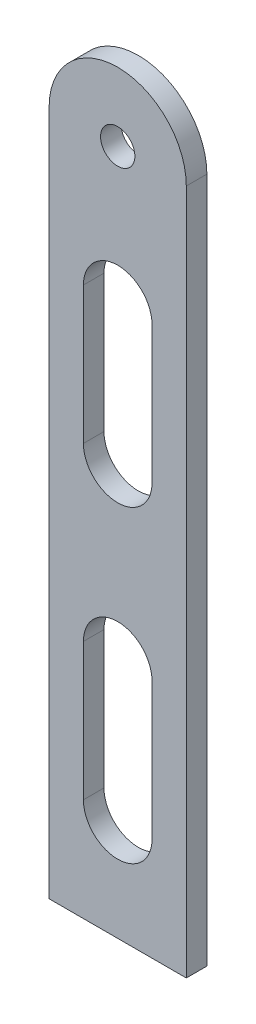
ISO-10303-21;
HEADER;
FILE_DESCRIPTION(('STEP AP214'),'2;1');
FILE_NAME('part.step','',(''),(''),'','','');
FILE_SCHEMA(('AUTOMOTIVE_DESIGN { 1 0 10303 214 1 1 1 1 }'));
ENDSEC;
DATA;
#1=APPLICATION_CONTEXT('core data for automotive mechanical design processes');
#2=APPLICATION_PROTOCOL_DEFINITION('international standard','automotive_design',2000,#1);
#3=PRODUCT_CONTEXT('',#1,'mechanical');
#4=PRODUCT('Part','Part','',(#3));
#5=PRODUCT_RELATED_PRODUCT_CATEGORY('part','',(#4));
#6=PRODUCT_DEFINITION_FORMATION('','',#4);
#7=PRODUCT_DEFINITION_CONTEXT('part definition',#1,'design');
#8=PRODUCT_DEFINITION('design','',#6,#7);
#9=PRODUCT_DEFINITION_SHAPE('','',#8);
#10=(LENGTH_UNIT() NAMED_UNIT(*) SI_UNIT(.MILLI.,.METRE.));
#11=(NAMED_UNIT(*) PLANE_ANGLE_UNIT() SI_UNIT($,.RADIAN.));
#12=(NAMED_UNIT(*) SI_UNIT($,.STERADIAN.) SOLID_ANGLE_UNIT());
#13=UNCERTAINTY_MEASURE_WITH_UNIT(LENGTH_MEASURE(1.E-05),#10,'distance_accuracy_value','');
#14=(GEOMETRIC_REPRESENTATION_CONTEXT(3) GLOBAL_UNCERTAINTY_ASSIGNED_CONTEXT((#13)) GLOBAL_UNIT_ASSIGNED_CONTEXT((#10,
#11,#12)) REPRESENTATION_CONTEXT('',''));
#15=CARTESIAN_POINT('',(0.,0.,0.));
#16=DIRECTION('',(0.,0.,1.));
#17=DIRECTION('',(1.,0.,0.));
#18=AXIS2_PLACEMENT_3D('',#15,#16,#17);
#19=CARTESIAN_POINT('',(0.,0.,3.));
#20=DIRECTION('',(0.,0.,1.));
#21=DIRECTION('',(1.,0.,0.));
#22=AXIS2_PLACEMENT_3D('',#19,#20,#21);
#23=PLANE('',#22);
#24=DIRECTION('',(0.,-1.,0.));
#25=VECTOR('',#24,1.);
#26=CARTESIAN_POINT('',(-5.,-20.0000000000001,3.));
#27=LINE('',#26,#25);
#28=CARTESIAN_POINT('',(-5.,-20.0000000000001,3.));
#29=VERTEX_POINT('',#28);
#30=CARTESIAN_POINT('',(-5.,-40.,3.));
#31=VERTEX_POINT('',#30);
#32=EDGE_CURVE('E159',#29,#31,#27,.T.);
#33=ORIENTED_EDGE('',*,*,#32,.F.);
#34=CARTESIAN_POINT('',(0.,-20.0000000000001,3.));
#35=DIRECTION('',(0.,0.,1.));
#36=DIRECTION('',(1.,0.,0.));
#37=AXIS2_PLACEMENT_3D('',#34,#35,#36);
#38=CIRCLE('',#37,5.);
#39=CARTESIAN_POINT('',(5.,-20.0000000000001,3.));
#40=VERTEX_POINT('',#39);
#41=EDGE_CURVE('E157',#40,#29,#38,.T.);
#42=ORIENTED_EDGE('',*,*,#41,.F.);
#43=DIRECTION('',(0.,1.,0.));
#44=VECTOR('',#43,1.);
#45=CARTESIAN_POINT('',(5.,-20.0000000000001,3.));
#46=LINE('',#45,#44);
#47=CARTESIAN_POINT('',(5.00000000000001,-40.,3.));
#48=VERTEX_POINT('',#47);
#49=EDGE_CURVE('E165',#48,#40,#46,.T.);
#50=ORIENTED_EDGE('',*,*,#49,.F.);
#51=CARTESIAN_POINT('',(0.,-40.,3.));
#52=DIRECTION('',(0.,0.,1.));
#53=DIRECTION('',(1.,0.,0.));
#54=AXIS2_PLACEMENT_3D('',#51,#52,#53);
#55=CIRCLE('',#54,5.);
#56=EDGE_CURVE('E162',#31,#48,#55,.T.);
#57=ORIENTED_EDGE('',*,*,#56,.F.);
#58=EDGE_LOOP('',(#33,#42,#50,#57));
#59=FACE_BOUND('',#58,.T.);
#60=CARTESIAN_POINT('',(0.,0.,3.));
#61=DIRECTION('',(0.,0.,1.));
#62=DIRECTION('',(1.,0.,0.));
#63=AXIS2_PLACEMENT_3D('',#60,#61,#62);
#64=CIRCLE('',#63,10.);
#65=CARTESIAN_POINT('',(10.,0.,3.));
#66=VERTEX_POINT('',#65);
#67=CARTESIAN_POINT('',(-10.,0.,3.));
#68=VERTEX_POINT('',#67);
#69=EDGE_CURVE('E194',#66,#68,#64,.T.);
#70=ORIENTED_EDGE('',*,*,#69,.T.);
#71=DIRECTION('',(0.,-1.,0.));
#72=VECTOR('',#71,1.);
#73=CARTESIAN_POINT('',(-10.,0.,3.));
#74=LINE('',#73,#72);
#75=CARTESIAN_POINT('',(-9.99999999999999,-100.,3.));
#76=VERTEX_POINT('',#75);
#77=EDGE_CURVE('E197',#68,#76,#74,.T.);
#78=ORIENTED_EDGE('',*,*,#77,.T.);
#79=DIRECTION('',(1.,0.,0.));
#80=VECTOR('',#79,1.);
#81=CARTESIAN_POINT('',(-9.99999999999999,-100.,3.));
#82=LINE('',#81,#80);
#83=CARTESIAN_POINT('',(10.,-100.,3.));
#84=VERTEX_POINT('',#83);
#85=EDGE_CURVE('E200',#76,#84,#82,.T.);
#86=ORIENTED_EDGE('',*,*,#85,.T.);
#87=DIRECTION('',(0.,1.,0.));
#88=VECTOR('',#87,1.);
#89=CARTESIAN_POINT('',(10.,0.,3.));
#90=LINE('',#89,#88);
#91=EDGE_CURVE('E202',#84,#66,#90,.T.);
#92=ORIENTED_EDGE('',*,*,#91,.T.);
#93=EDGE_LOOP('',(#70,#78,#86,#92));
#94=FACE_BOUND('',#93,.T.);
#95=CARTESIAN_POINT('',(0.,0.,3.));
#96=DIRECTION('',(0.,0.,1.));
#97=DIRECTION('',(1.,0.,0.));
#98=AXIS2_PLACEMENT_3D('',#95,#96,#97);
#99=CIRCLE('',#98,2.5);
#100=CARTESIAN_POINT('',(2.5,0.,3.));
#101=VERTEX_POINT('',#100);
#102=EDGE_CURVE('E188',#101,#101,#99,.T.);
#103=ORIENTED_EDGE('',*,*,#102,.F.);
#104=EDGE_LOOP('',(#103));
#105=FACE_BOUND('',#104,.T.);
#106=DIRECTION('',(0.,1.,0.));
#107=VECTOR('',#106,1.);
#108=CARTESIAN_POINT('',(5.00000000000002,-85.,3.));
#109=LINE('',#108,#107);
#110=CARTESIAN_POINT('',(5.00000000000002,-85.,3.));
#111=VERTEX_POINT('',#110);
#112=CARTESIAN_POINT('',(5.00000000000002,-65.,3.));
#113=VERTEX_POINT('',#112);
#114=EDGE_CURVE('E129',#111,#113,#109,.T.);
#115=ORIENTED_EDGE('',*,*,#114,.F.);
#116=CARTESIAN_POINT('',(0.,-85.,3.));
#117=DIRECTION('',(0.,0.,1.));
#118=DIRECTION('',(1.,0.,0.));
#119=AXIS2_PLACEMENT_3D('',#116,#117,#118);
#120=CIRCLE('',#119,5.);
#121=CARTESIAN_POINT('',(-4.99999999999999,-85.,3.));
#122=VERTEX_POINT('',#121);
#123=EDGE_CURVE('E121',#122,#111,#120,.T.);
#124=ORIENTED_EDGE('',*,*,#123,.F.);
#125=DIRECTION('',(0.,-1.,0.));
#126=VECTOR('',#125,1.);
#127=CARTESIAN_POINT('',(-4.99999999999999,-85.,3.));
#128=LINE('',#127,#126);
#129=CARTESIAN_POINT('',(-4.99999999999999,-65.,3.));
#130=VERTEX_POINT('',#129);
#131=EDGE_CURVE('E143',#130,#122,#128,.T.);
#132=ORIENTED_EDGE('',*,*,#131,.F.);
#133=CARTESIAN_POINT('',(0.,-65.,3.));
#134=DIRECTION('',(0.,0.,1.));
#135=DIRECTION('',(1.,0.,0.));
#136=AXIS2_PLACEMENT_3D('',#133,#134,#135);
#137=CIRCLE('',#136,5.);
#138=EDGE_CURVE('E141',#113,#130,#137,.T.);
#139=ORIENTED_EDGE('',*,*,#138,.F.);
#140=EDGE_LOOP('',(#115,#124,#132,#139));
#141=FACE_BOUND('',#140,.T.);
#142=ADVANCED_FACE('F32',(#59,#94,#105,#141),#23,.T.);
#143=CARTESIAN_POINT('',(0.,0.,0.));
#144=DIRECTION('',(0.,0.,1.));
#145=DIRECTION('',(1.,0.,0.));
#146=AXIS2_PLACEMENT_3D('',#143,#144,#145);
#147=PLANE('',#146);
#148=CARTESIAN_POINT('',(0.,-20.0000000000001,0.));
#149=DIRECTION('',(0.,0.,1.));
#150=DIRECTION('',(1.,0.,0.));
#151=AXIS2_PLACEMENT_3D('',#148,#149,#150);
#152=CIRCLE('',#151,5.);
#153=CARTESIAN_POINT('',(5.,-20.0000000000001,0.));
#154=VERTEX_POINT('',#153);
#155=CARTESIAN_POINT('',(-5.,-20.0000000000001,0.));
#156=VERTEX_POINT('',#155);
#157=EDGE_CURVE('E137',#154,#156,#152,.T.);
#158=ORIENTED_EDGE('',*,*,#157,.T.);
#159=DIRECTION('',(0.,-1.,0.));
#160=VECTOR('',#159,1.);
#161=CARTESIAN_POINT('',(-5.,-20.0000000000001,0.));
#162=LINE('',#161,#160);
#163=CARTESIAN_POINT('',(-5.,-40.,0.));
#164=VERTEX_POINT('',#163);
#165=EDGE_CURVE('E170',#156,#164,#162,.T.);
#166=ORIENTED_EDGE('',*,*,#165,.T.);
#167=CARTESIAN_POINT('',(0.,-40.,0.));
#168=DIRECTION('',(0.,0.,1.));
#169=DIRECTION('',(1.,0.,0.));
#170=AXIS2_PLACEMENT_3D('',#167,#168,#169);
#171=CIRCLE('',#170,5.);
#172=CARTESIAN_POINT('',(5.00000000000001,-40.,0.));
#173=VERTEX_POINT('',#172);
#174=EDGE_CURVE('E173',#164,#173,#171,.T.);
#175=ORIENTED_EDGE('',*,*,#174,.T.);
#176=DIRECTION('',(0.,1.,0.));
#177=VECTOR('',#176,1.);
#178=CARTESIAN_POINT('',(5.,-20.0000000000001,0.));
#179=LINE('',#178,#177);
#180=EDGE_CURVE('E160',#173,#154,#179,.T.);
#181=ORIENTED_EDGE('',*,*,#180,.T.);
#182=EDGE_LOOP('',(#158,#166,#175,#181));
#183=FACE_BOUND('',#182,.T.);
#184=CARTESIAN_POINT('',(0.,0.,0.));
#185=DIRECTION('',(0.,0.,1.));
#186=DIRECTION('',(1.,0.,0.));
#187=AXIS2_PLACEMENT_3D('',#184,#185,#186);
#188=CIRCLE('',#187,10.);
#189=CARTESIAN_POINT('',(10.,0.,0.));
#190=VERTEX_POINT('',#189);
#191=CARTESIAN_POINT('',(-10.,0.,0.));
#192=VERTEX_POINT('',#191);
#193=EDGE_CURVE('E191',#190,#192,#188,.T.);
#194=ORIENTED_EDGE('',*,*,#193,.F.);
#195=DIRECTION('',(0.,1.,0.));
#196=VECTOR('',#195,1.);
#197=CARTESIAN_POINT('',(10.,0.,0.));
#198=LINE('',#197,#196);
#199=CARTESIAN_POINT('',(10.,-100.,0.));
#200=VERTEX_POINT('',#199);
#201=EDGE_CURVE('E198',#200,#190,#198,.T.);
#202=ORIENTED_EDGE('',*,*,#201,.F.);
#203=DIRECTION('',(1.,0.,0.));
#204=VECTOR('',#203,1.);
#205=CARTESIAN_POINT('',(-9.99999999999999,-100.,0.));
#206=LINE('',#205,#204);
#207=CARTESIAN_POINT('',(-9.99999999999999,-100.,0.));
#208=VERTEX_POINT('',#207);
#209=EDGE_CURVE('E209',#208,#200,#206,.T.);
#210=ORIENTED_EDGE('',*,*,#209,.F.);
#211=DIRECTION('',(0.,-1.,0.));
#212=VECTOR('',#211,1.);
#213=CARTESIAN_POINT('',(-10.,0.,0.));
#214=LINE('',#213,#212);
#215=EDGE_CURVE('E207',#192,#208,#214,.T.);
#216=ORIENTED_EDGE('',*,*,#215,.F.);
#217=EDGE_LOOP('',(#194,#202,#210,#216));
#218=FACE_BOUND('',#217,.T.);
#219=CARTESIAN_POINT('',(0.,0.,0.));
#220=DIRECTION('',(0.,0.,1.));
#221=DIRECTION('',(1.,0.,0.));
#222=AXIS2_PLACEMENT_3D('',#219,#220,#221);
#223=CIRCLE('',#222,2.5);
#224=CARTESIAN_POINT('',(2.5,0.,0.));
#225=VERTEX_POINT('',#224);
#226=EDGE_CURVE('E187',#225,#225,#223,.T.);
#227=ORIENTED_EDGE('',*,*,#226,.T.);
#228=EDGE_LOOP('',(#227));
#229=FACE_BOUND('',#228,.T.);
#230=CARTESIAN_POINT('',(0.,-85.,0.));
#231=DIRECTION('',(0.,0.,1.));
#232=DIRECTION('',(1.,0.,0.));
#233=AXIS2_PLACEMENT_3D('',#230,#231,#232);
#234=CIRCLE('',#233,5.);
#235=CARTESIAN_POINT('',(-4.99999999999999,-85.,0.));
#236=VERTEX_POINT('',#235);
#237=CARTESIAN_POINT('',(5.00000000000002,-85.,0.));
#238=VERTEX_POINT('',#237);
#239=EDGE_CURVE('E55',#236,#238,#234,.T.);
#240=ORIENTED_EDGE('',*,*,#239,.T.);
#241=DIRECTION('',(0.,1.,0.));
#242=VECTOR('',#241,1.);
#243=CARTESIAN_POINT('',(5.00000000000002,-85.,0.));
#244=LINE('',#243,#242);
#245=CARTESIAN_POINT('',(5.00000000000002,-65.,0.));
#246=VERTEX_POINT('',#245);
#247=EDGE_CURVE('E136',#238,#246,#244,.T.);
#248=ORIENTED_EDGE('',*,*,#247,.T.);
#249=CARTESIAN_POINT('',(0.,-65.,0.));
#250=DIRECTION('',(0.,0.,1.));
#251=DIRECTION('',(1.,0.,0.));
#252=AXIS2_PLACEMENT_3D('',#249,#250,#251);
#253=CIRCLE('',#252,5.);
#254=CARTESIAN_POINT('',(-4.99999999999999,-65.,0.));
#255=VERTEX_POINT('',#254);
#256=EDGE_CURVE('E149',#246,#255,#253,.T.);
#257=ORIENTED_EDGE('',*,*,#256,.T.);
#258=DIRECTION('',(0.,-1.,0.));
#259=VECTOR('',#258,1.);
#260=CARTESIAN_POINT('',(-4.99999999999999,-85.,0.));
#261=LINE('',#260,#259);
#262=EDGE_CURVE('E130',#255,#236,#261,.T.);
#263=ORIENTED_EDGE('',*,*,#262,.T.);
#264=EDGE_LOOP('',(#240,#248,#257,#263));
#265=FACE_BOUND('',#264,.T.);
#266=ADVANCED_FACE('F227',(#183,#218,#229,#265),#147,.F.);
#267=CARTESIAN_POINT('',(0.,0.,3.));
#268=DIRECTION('',(0.,0.,-1.));
#269=DIRECTION('',(-1.,0.,0.));
#270=AXIS2_PLACEMENT_3D('',#267,#268,#269);
#271=CYLINDRICAL_SURFACE('',#270,10.);
#272=ORIENTED_EDGE('',*,*,#193,.T.);
#273=DIRECTION('',(0.,0.,-1.));
#274=VECTOR('',#273,1.);
#275=CARTESIAN_POINT('',(-10.,0.,3.));
#276=LINE('',#275,#274);
#277=EDGE_CURVE('E11',#68,#192,#276,.T.);
#278=ORIENTED_EDGE('',*,*,#277,.F.);
#279=ORIENTED_EDGE('',*,*,#69,.F.);
#280=DIRECTION('',(0.,0.,-1.));
#281=VECTOR('',#280,1.);
#282=CARTESIAN_POINT('',(10.,0.,3.));
#283=LINE('',#282,#281);
#284=EDGE_CURVE('E204',#66,#190,#283,.T.);
#285=ORIENTED_EDGE('',*,*,#284,.T.);
#286=EDGE_LOOP('',(#272,#278,#279,#285));
#287=FACE_BOUND('',#286,.T.);
#288=ADVANCED_FACE('F34',(#287),#271,.T.);
#289=CARTESIAN_POINT('',(-10.,0.,3.));
#290=DIRECTION('',(1.,0.,0.));
#291=DIRECTION('',(0.,1.,0.));
#292=AXIS2_PLACEMENT_3D('',#289,#290,#291);
#293=PLANE('',#292);
#294=ORIENTED_EDGE('',*,*,#215,.T.);
#295=DIRECTION('',(0.,0.,-1.));
#296=VECTOR('',#295,1.);
#297=CARTESIAN_POINT('',(-9.99999999999999,-100.,3.));
#298=LINE('',#297,#296);
#299=EDGE_CURVE('E40',#76,#208,#298,.T.);
#300=ORIENTED_EDGE('',*,*,#299,.F.);
#301=ORIENTED_EDGE('',*,*,#77,.F.);
#302=ORIENTED_EDGE('',*,*,#277,.T.);
#303=EDGE_LOOP('',(#294,#300,#301,#302));
#304=FACE_BOUND('',#303,.T.);
#305=ADVANCED_FACE('F238',(#304),#293,.F.);
#306=CARTESIAN_POINT('',(-9.99999999999999,-100.,3.));
#307=DIRECTION('',(0.,1.,0.));
#308=DIRECTION('',(0.,0.,1.));
#309=AXIS2_PLACEMENT_3D('',#306,#307,#308);
#310=PLANE('',#309);
#311=ORIENTED_EDGE('',*,*,#209,.T.);
#312=DIRECTION('',(0.,0.,-1.));
#313=VECTOR('',#312,1.);
#314=CARTESIAN_POINT('',(10.,-100.,3.));
#315=LINE('',#314,#313);
#316=EDGE_CURVE('E214',#84,#200,#315,.T.);
#317=ORIENTED_EDGE('',*,*,#316,.F.);
#318=ORIENTED_EDGE('',*,*,#85,.F.);
#319=ORIENTED_EDGE('',*,*,#299,.T.);
#320=EDGE_LOOP('',(#311,#317,#318,#319));
#321=FACE_BOUND('',#320,.T.);
#322=ADVANCED_FACE('F221',(#321),#310,.F.);
#323=CARTESIAN_POINT('',(10.,0.,3.));
#324=DIRECTION('',(-1.,0.,0.));
#325=DIRECTION('',(0.,-1.,0.));
#326=AXIS2_PLACEMENT_3D('',#323,#324,#325);
#327=PLANE('',#326);
#328=ORIENTED_EDGE('',*,*,#201,.T.);
#329=ORIENTED_EDGE('',*,*,#284,.F.);
#330=ORIENTED_EDGE('',*,*,#91,.F.);
#331=ORIENTED_EDGE('',*,*,#316,.T.);
#332=EDGE_LOOP('',(#328,#329,#330,#331));
#333=FACE_BOUND('',#332,.T.);
#334=ADVANCED_FACE('F231',(#333),#327,.F.);
#335=CARTESIAN_POINT('',(0.,0.,3.));
#336=DIRECTION('',(0.,0.,-1.));
#337=DIRECTION('',(-1.,0.,0.));
#338=AXIS2_PLACEMENT_3D('',#335,#336,#337);
#339=CYLINDRICAL_SURFACE('',#338,2.5);
#340=ORIENTED_EDGE('',*,*,#102,.T.);
#341=EDGE_LOOP('',(#340));
#342=FACE_BOUND('',#341,.T.);
#343=ORIENTED_EDGE('',*,*,#226,.F.);
#344=EDGE_LOOP('',(#343));
#345=FACE_BOUND('',#344,.T.);
#346=ADVANCED_FACE('F255',(#342,#345),#339,.F.);
#347=CARTESIAN_POINT('',(0.,-20.0000000000001,3.));
#348=DIRECTION('',(0.,0.,-1.));
#349=DIRECTION('',(-1.,0.,0.));
#350=AXIS2_PLACEMENT_3D('',#347,#348,#349);
#351=CYLINDRICAL_SURFACE('',#350,5.);
#352=ORIENTED_EDGE('',*,*,#157,.F.);
#353=DIRECTION('',(0.,0.,-1.));
#354=VECTOR('',#353,1.);
#355=CARTESIAN_POINT('',(5.,-20.0000000000001,3.));
#356=LINE('',#355,#354);
#357=EDGE_CURVE('E167',#40,#154,#356,.T.);
#358=ORIENTED_EDGE('',*,*,#357,.F.);
#359=ORIENTED_EDGE('',*,*,#41,.T.);
#360=DIRECTION('',(0.,0.,-1.));
#361=VECTOR('',#360,1.);
#362=CARTESIAN_POINT('',(-5.,-20.0000000000001,3.));
#363=LINE('',#362,#361);
#364=EDGE_CURVE('E184',#29,#156,#363,.T.);
#365=ORIENTED_EDGE('',*,*,#364,.T.);
#366=EDGE_LOOP('',(#352,#358,#359,#365));
#367=FACE_BOUND('',#366,.T.);
#368=ADVANCED_FACE('F262',(#367),#351,.F.);
#369=CARTESIAN_POINT('',(-5.,-20.0000000000001,3.));
#370=DIRECTION('',(1.,0.,0.));
#371=DIRECTION('',(0.,1.,0.));
#372=AXIS2_PLACEMENT_3D('',#369,#370,#371);
#373=PLANE('',#372);
#374=ORIENTED_EDGE('',*,*,#165,.F.);
#375=ORIENTED_EDGE('',*,*,#364,.F.);
#376=ORIENTED_EDGE('',*,*,#32,.T.);
#377=DIRECTION('',(0.,0.,-1.));
#378=VECTOR('',#377,1.);
#379=CARTESIAN_POINT('',(-5.,-40.,3.));
#380=LINE('',#379,#378);
#381=EDGE_CURVE('E182',#31,#164,#380,.T.);
#382=ORIENTED_EDGE('',*,*,#381,.T.);
#383=EDGE_LOOP('',(#374,#375,#376,#382));
#384=FACE_BOUND('',#383,.T.);
#385=ADVANCED_FACE('F267',(#384),#373,.T.);
#386=CARTESIAN_POINT('',(0.,-40.,3.));
#387=DIRECTION('',(0.,0.,-1.));
#388=DIRECTION('',(-1.,0.,0.));
#389=AXIS2_PLACEMENT_3D('',#386,#387,#388);
#390=CYLINDRICAL_SURFACE('',#389,5.);
#391=ORIENTED_EDGE('',*,*,#174,.F.);
#392=ORIENTED_EDGE('',*,*,#381,.F.);
#393=ORIENTED_EDGE('',*,*,#56,.T.);
#394=DIRECTION('',(0.,0.,-1.));
#395=VECTOR('',#394,1.);
#396=CARTESIAN_POINT('',(5.00000000000001,-40.,3.));
#397=LINE('',#396,#395);
#398=EDGE_CURVE('E180',#48,#173,#397,.T.);
#399=ORIENTED_EDGE('',*,*,#398,.T.);
#400=EDGE_LOOP('',(#391,#392,#393,#399));
#401=FACE_BOUND('',#400,.T.);
#402=ADVANCED_FACE('F291',(#401),#390,.F.);
#403=CARTESIAN_POINT('',(5.,-20.0000000000001,3.));
#404=DIRECTION('',(-1.,0.,0.));
#405=DIRECTION('',(0.,-1.,0.));
#406=AXIS2_PLACEMENT_3D('',#403,#404,#405);
#407=PLANE('',#406);
#408=ORIENTED_EDGE('',*,*,#180,.F.);
#409=ORIENTED_EDGE('',*,*,#398,.F.);
#410=ORIENTED_EDGE('',*,*,#49,.T.);
#411=ORIENTED_EDGE('',*,*,#357,.T.);
#412=EDGE_LOOP('',(#408,#409,#410,#411));
#413=FACE_BOUND('',#412,.T.);
#414=ADVANCED_FACE('F288',(#413),#407,.T.);
#415=CARTESIAN_POINT('',(0.,-85.,3.));
#416=DIRECTION('',(0.,0.,-1.));
#417=DIRECTION('',(-1.,0.,0.));
#418=AXIS2_PLACEMENT_3D('',#415,#416,#417);
#419=CYLINDRICAL_SURFACE('',#418,5.);
#420=ORIENTED_EDGE('',*,*,#239,.F.);
#421=DIRECTION('',(0.,0.,-1.));
#422=VECTOR('',#421,1.);
#423=CARTESIAN_POINT('',(-4.99999999999999,-85.,3.));
#424=LINE('',#423,#422);
#425=EDGE_CURVE('E125',#122,#236,#424,.T.);
#426=ORIENTED_EDGE('',*,*,#425,.F.);
#427=ORIENTED_EDGE('',*,*,#123,.T.);
#428=DIRECTION('',(0.,0.,-1.));
#429=VECTOR('',#428,1.);
#430=CARTESIAN_POINT('',(5.00000000000002,-85.,3.));
#431=LINE('',#430,#429);
#432=EDGE_CURVE('E124',#111,#238,#431,.T.);
#433=ORIENTED_EDGE('',*,*,#432,.T.);
#434=EDGE_LOOP('',(#420,#426,#427,#433));
#435=FACE_BOUND('',#434,.T.);
#436=ADVANCED_FACE('F123',(#435),#419,.F.);
#437=CARTESIAN_POINT('',(5.00000000000002,-85.,3.));
#438=DIRECTION('',(-1.,0.,0.));
#439=DIRECTION('',(0.,0.,1.));
#440=AXIS2_PLACEMENT_3D('',#437,#438,#439);
#441=PLANE('',#440);
#442=ORIENTED_EDGE('',*,*,#247,.F.);
#443=ORIENTED_EDGE('',*,*,#432,.F.);
#444=ORIENTED_EDGE('',*,*,#114,.T.);
#445=DIRECTION('',(0.,0.,-1.));
#446=VECTOR('',#445,1.);
#447=CARTESIAN_POINT('',(5.00000000000002,-65.,3.));
#448=LINE('',#447,#446);
#449=EDGE_CURVE('E138',#113,#246,#448,.T.);
#450=ORIENTED_EDGE('',*,*,#449,.T.);
#451=EDGE_LOOP('',(#442,#443,#444,#450));
#452=FACE_BOUND('',#451,.T.);
#453=ADVANCED_FACE('F133',(#452),#441,.T.);
#454=CARTESIAN_POINT('',(0.,-65.,3.));
#455=DIRECTION('',(0.,0.,-1.));
#456=DIRECTION('',(-1.,0.,0.));
#457=AXIS2_PLACEMENT_3D('',#454,#455,#456);
#458=CYLINDRICAL_SURFACE('',#457,5.);
#459=ORIENTED_EDGE('',*,*,#256,.F.);
#460=ORIENTED_EDGE('',*,*,#449,.F.);
#461=ORIENTED_EDGE('',*,*,#138,.T.);
#462=DIRECTION('',(0.,0.,-1.));
#463=VECTOR('',#462,1.);
#464=CARTESIAN_POINT('',(-4.99999999999999,-65.,3.));
#465=LINE('',#464,#463);
#466=EDGE_CURVE('E47',#130,#255,#465,.T.);
#467=ORIENTED_EDGE('',*,*,#466,.T.);
#468=EDGE_LOOP('',(#459,#460,#461,#467));
#469=FACE_BOUND('',#468,.T.);
#470=ADVANCED_FACE('F276',(#469),#458,.F.);
#471=CARTESIAN_POINT('',(-4.99999999999999,-85.,3.));
#472=DIRECTION('',(1.,0.,0.));
#473=DIRECTION('',(0.,0.,-1.));
#474=AXIS2_PLACEMENT_3D('',#471,#472,#473);
#475=PLANE('',#474);
#476=ORIENTED_EDGE('',*,*,#262,.F.);
#477=ORIENTED_EDGE('',*,*,#466,.F.);
#478=ORIENTED_EDGE('',*,*,#131,.T.);
#479=ORIENTED_EDGE('',*,*,#425,.T.);
#480=EDGE_LOOP('',(#476,#477,#478,#479));
#481=FACE_BOUND('',#480,.T.);
#482=ADVANCED_FACE('F274',(#481),#475,.T.);
#483=CLOSED_SHELL('',(#142,#266,#288,#305,#322,#334,#346,#368,#385,#402,#414,#436,#453,#470,#482));
#484=MANIFOLD_SOLID_BREP('B2',#483);
#485=ADVANCED_BREP_SHAPE_REPRESENTATION('',(#18,#484),#14);
#486=SHAPE_DEFINITION_REPRESENTATION(#9,#485);
ENDSEC;
END-ISO-10303-21;
